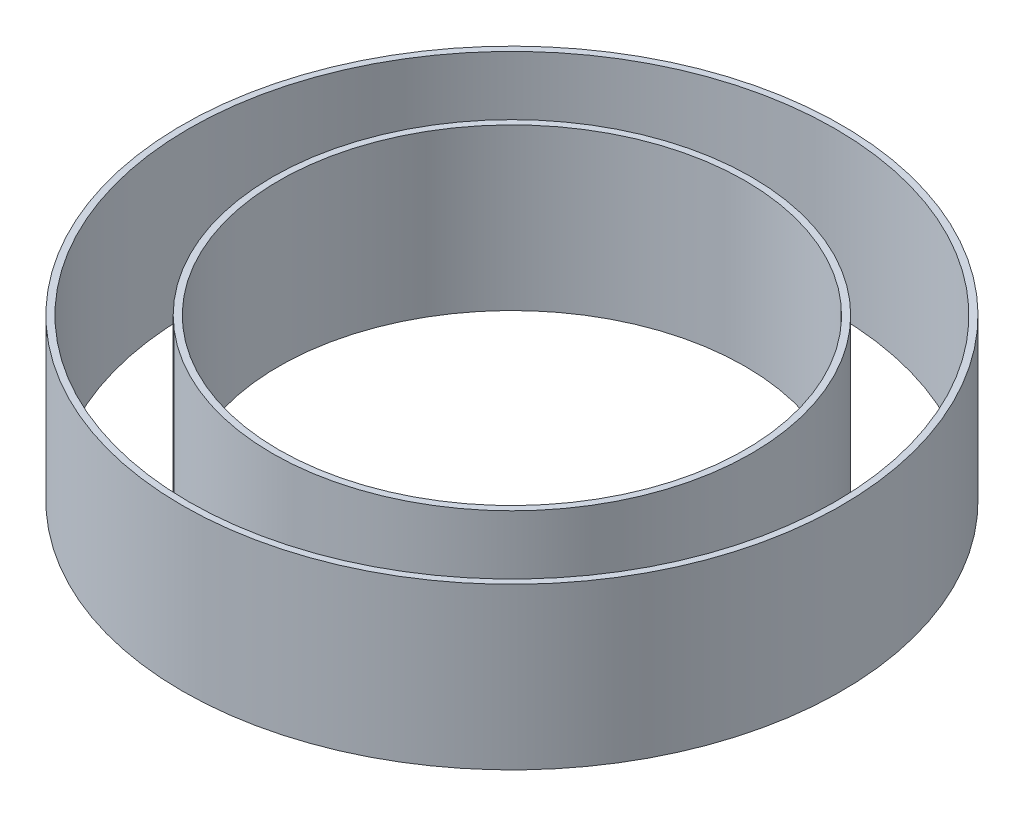
ISO-10303-21;
HEADER;
FILE_DESCRIPTION(('STEP AP214'),'2;1');
FILE_NAME('part.step','',(''),(''),'','','');
FILE_SCHEMA(('AUTOMOTIVE_DESIGN { 1 0 10303 214 1 1 1 1 }'));
ENDSEC;
DATA;
#1=APPLICATION_CONTEXT('core data for automotive mechanical design processes');
#2=APPLICATION_PROTOCOL_DEFINITION('international standard','automotive_design',2000,#1);
#3=PRODUCT_CONTEXT('',#1,'mechanical');
#4=PRODUCT('Part','Part','',(#3));
#5=PRODUCT_RELATED_PRODUCT_CATEGORY('part','',(#4));
#6=PRODUCT_DEFINITION_FORMATION('','',#4);
#7=PRODUCT_DEFINITION_CONTEXT('part definition',#1,'design');
#8=PRODUCT_DEFINITION('design','',#6,#7);
#9=PRODUCT_DEFINITION_SHAPE('','',#8);
#10=(LENGTH_UNIT() NAMED_UNIT(*) SI_UNIT(.MILLI.,.METRE.));
#11=(NAMED_UNIT(*) PLANE_ANGLE_UNIT() SI_UNIT($,.RADIAN.));
#12=(NAMED_UNIT(*) SI_UNIT($,.STERADIAN.) SOLID_ANGLE_UNIT());
#13=UNCERTAINTY_MEASURE_WITH_UNIT(LENGTH_MEASURE(1.E-05),#10,'distance_accuracy_value','');
#14=(GEOMETRIC_REPRESENTATION_CONTEXT(3) GLOBAL_UNCERTAINTY_ASSIGNED_CONTEXT((#13)) GLOBAL_UNIT_ASSIGNED_CONTEXT((#10,
#11,#12)) REPRESENTATION_CONTEXT('',''));
#15=CARTESIAN_POINT('',(0.,0.,0.));
#16=DIRECTION('',(0.,0.,1.));
#17=DIRECTION('',(1.,0.,0.));
#18=AXIS2_PLACEMENT_3D('',#15,#16,#17);
#19=CARTESIAN_POINT('',(0.,5.,0.));
#20=DIRECTION('',(0.,1.,0.));
#21=DIRECTION('',(0.,0.,1.));
#22=AXIS2_PLACEMENT_3D('',#19,#20,#21);
#23=PLANE('',#22);
#24=CARTESIAN_POINT('',(0.,5.,0.));
#25=DIRECTION('',(0.,1.,0.));
#26=DIRECTION('',(0.,0.,1.));
#27=AXIS2_PLACEMENT_3D('',#24,#25,#26);
#28=CIRCLE('',#27,14.9);
#29=CARTESIAN_POINT('',(0.,5.,14.9));
#30=VERTEX_POINT('',#29);
#31=EDGE_CURVE('E72',#30,#30,#28,.T.);
#32=ORIENTED_EDGE('',*,*,#31,.T.);
#33=EDGE_LOOP('',(#32));
#34=FACE_BOUND('',#33,.T.);
#35=CARTESIAN_POINT('',(0.,5.,0.));
#36=DIRECTION('',(0.,1.,0.));
#37=DIRECTION('',(0.,0.,1.));
#38=AXIS2_PLACEMENT_3D('',#35,#36,#37);
#39=CIRCLE('',#38,14.5);
#40=CARTESIAN_POINT('',(0.,5.,14.5));
#41=VERTEX_POINT('',#40);
#42=EDGE_CURVE('E63',#41,#41,#39,.T.);
#43=ORIENTED_EDGE('',*,*,#42,.F.);
#44=EDGE_LOOP('',(#43));
#45=FACE_BOUND('',#44,.T.);
#46=ADVANCED_FACE('F59',(#34,#45),#23,.T.);
#47=CARTESIAN_POINT('',(0.,-5.,0.));
#48=DIRECTION('',(0.,1.,0.));
#49=DIRECTION('',(0.,0.,1.));
#50=AXIS2_PLACEMENT_3D('',#47,#48,#49);
#51=PLANE('',#50);
#52=CARTESIAN_POINT('',(0.,-5.,0.));
#53=DIRECTION('',(0.,1.,0.));
#54=DIRECTION('',(0.,0.,1.));
#55=AXIS2_PLACEMENT_3D('',#52,#53,#54);
#56=CIRCLE('',#55,14.9);
#57=CARTESIAN_POINT('',(0.,-5.,14.9));
#58=VERTEX_POINT('',#57);
#59=EDGE_CURVE('E70',#58,#58,#56,.T.);
#60=ORIENTED_EDGE('',*,*,#59,.F.);
#61=EDGE_LOOP('',(#60));
#62=FACE_BOUND('',#61,.T.);
#63=CARTESIAN_POINT('',(0.,-5.,0.));
#64=DIRECTION('',(0.,1.,0.));
#65=DIRECTION('',(0.,0.,1.));
#66=AXIS2_PLACEMENT_3D('',#63,#64,#65);
#67=CIRCLE('',#66,14.5);
#68=CARTESIAN_POINT('',(0.,-5.,14.5));
#69=VERTEX_POINT('',#68);
#70=EDGE_CURVE('E12',#69,#69,#67,.T.);
#71=ORIENTED_EDGE('',*,*,#70,.T.);
#72=EDGE_LOOP('',(#71));
#73=FACE_BOUND('',#72,.T.);
#74=ADVANCED_FACE('F80',(#62,#73),#51,.F.);
#75=CARTESIAN_POINT('',(0.,5.,0.));
#76=DIRECTION('',(0.,-1.,0.));
#77=DIRECTION('',(0.,0.,-1.));
#78=AXIS2_PLACEMENT_3D('',#75,#76,#77);
#79=CYLINDRICAL_SURFACE('',#78,14.9);
#80=ORIENTED_EDGE('',*,*,#31,.F.);
#81=EDGE_LOOP('',(#80));
#82=FACE_BOUND('',#81,.T.);
#83=ORIENTED_EDGE('',*,*,#59,.T.);
#84=EDGE_LOOP('',(#83));
#85=FACE_BOUND('',#84,.T.);
#86=ADVANCED_FACE('F78',(#82,#85),#79,.T.);
#87=CARTESIAN_POINT('',(0.,5.,0.));
#88=DIRECTION('',(0.,-1.,0.));
#89=DIRECTION('',(0.,0.,-1.));
#90=AXIS2_PLACEMENT_3D('',#87,#88,#89);
#91=CYLINDRICAL_SURFACE('',#90,14.5);
#92=ORIENTED_EDGE('',*,*,#42,.T.);
#93=EDGE_LOOP('',(#92));
#94=FACE_BOUND('',#93,.T.);
#95=ORIENTED_EDGE('',*,*,#70,.F.);
#96=EDGE_LOOP('',(#95));
#97=FACE_BOUND('',#96,.T.);
#98=ADVANCED_FACE('F61',(#94,#97),#91,.F.);
#99=CLOSED_SHELL('',(#46,#74,#86,#98));
#100=MANIFOLD_SOLID_BREP('B2',#99);
#101=CARTESIAN_POINT('',(0.,5.,0.));
#102=DIRECTION('',(0.,-1.,0.));
#103=DIRECTION('',(0.,0.,-1.));
#104=AXIS2_PLACEMENT_3D('',#101,#102,#103);
#105=CYLINDRICAL_SURFACE('',#104,20.1);
#106=CARTESIAN_POINT('',(0.,5.,0.));
#107=DIRECTION('',(0.,1.,0.));
#108=DIRECTION('',(0.,0.,1.));
#109=AXIS2_PLACEMENT_3D('',#106,#107,#108);
#110=CIRCLE('',#109,20.1);
#111=CARTESIAN_POINT('',(0.,5.,20.1));
#112=VERTEX_POINT('',#111);
#113=EDGE_CURVE('E128',#112,#112,#110,.T.);
#114=ORIENTED_EDGE('',*,*,#113,.T.);
#115=EDGE_LOOP('',(#114));
#116=FACE_BOUND('',#115,.T.);
#117=CARTESIAN_POINT('',(0.,-5.,0.));
#118=DIRECTION('',(0.,1.,0.));
#119=DIRECTION('',(0.,0.,1.));
#120=AXIS2_PLACEMENT_3D('',#117,#118,#119);
#121=CIRCLE('',#120,20.1);
#122=CARTESIAN_POINT('',(0.,-5.,20.1));
#123=VERTEX_POINT('',#122);
#124=EDGE_CURVE('E134',#123,#123,#121,.T.);
#125=ORIENTED_EDGE('',*,*,#124,.F.);
#126=EDGE_LOOP('',(#125));
#127=FACE_BOUND('',#126,.T.);
#128=ADVANCED_FACE('F121',(#116,#127),#105,.F.);
#129=CARTESIAN_POINT('',(0.,5.,0.));
#130=DIRECTION('',(0.,-1.,0.));
#131=DIRECTION('',(0.,0.,-1.));
#132=AXIS2_PLACEMENT_3D('',#129,#130,#131);
#133=CYLINDRICAL_SURFACE('',#132,20.5);
#134=CARTESIAN_POINT('',(0.,5.,0.));
#135=DIRECTION('',(0.,1.,0.));
#136=DIRECTION('',(0.,0.,1.));
#137=AXIS2_PLACEMENT_3D('',#134,#135,#136);
#138=CIRCLE('',#137,20.5);
#139=CARTESIAN_POINT('',(0.,5.,20.5));
#140=VERTEX_POINT('',#139);
#141=EDGE_CURVE('E58',#140,#140,#138,.T.);
#142=ORIENTED_EDGE('',*,*,#141,.F.);
#143=EDGE_LOOP('',(#142));
#144=FACE_BOUND('',#143,.T.);
#145=CARTESIAN_POINT('',(0.,-5.,0.));
#146=DIRECTION('',(0.,1.,0.));
#147=DIRECTION('',(0.,0.,1.));
#148=AXIS2_PLACEMENT_3D('',#145,#146,#147);
#149=CIRCLE('',#148,20.5);
#150=CARTESIAN_POINT('',(0.,-5.,20.5));
#151=VERTEX_POINT('',#150);
#152=EDGE_CURVE('E124',#151,#151,#149,.T.);
#153=ORIENTED_EDGE('',*,*,#152,.T.);
#154=EDGE_LOOP('',(#153));
#155=FACE_BOUND('',#154,.T.);
#156=ADVANCED_FACE('F141',(#144,#155),#133,.T.);
#157=CARTESIAN_POINT('',(0.,5.,0.));
#158=DIRECTION('',(0.,1.,0.));
#159=DIRECTION('',(0.,0.,1.));
#160=AXIS2_PLACEMENT_3D('',#157,#158,#159);
#161=PLANE('',#160);
#162=ORIENTED_EDGE('',*,*,#113,.F.);
#163=EDGE_LOOP('',(#162));
#164=FACE_BOUND('',#163,.T.);
#165=ORIENTED_EDGE('',*,*,#141,.T.);
#166=EDGE_LOOP('',(#165));
#167=FACE_BOUND('',#166,.T.);
#168=ADVANCED_FACE('F145',(#164,#167),#161,.T.);
#169=CARTESIAN_POINT('',(0.,-5.,0.));
#170=DIRECTION('',(0.,1.,0.));
#171=DIRECTION('',(0.,0.,1.));
#172=AXIS2_PLACEMENT_3D('',#169,#170,#171);
#173=PLANE('',#172);
#174=ORIENTED_EDGE('',*,*,#124,.T.);
#175=EDGE_LOOP('',(#174));
#176=FACE_BOUND('',#175,.T.);
#177=ORIENTED_EDGE('',*,*,#152,.F.);
#178=EDGE_LOOP('',(#177));
#179=FACE_BOUND('',#178,.T.);
#180=ADVANCED_FACE('F143',(#176,#179),#173,.F.);
#181=CLOSED_SHELL('',(#128,#156,#168,#180));
#182=MANIFOLD_SOLID_BREP('B7',#181);
#183=ADVANCED_BREP_SHAPE_REPRESENTATION('',(#18,#100,#182),#14);
#184=SHAPE_DEFINITION_REPRESENTATION(#9,#183);
ENDSEC;
END-ISO-10303-21;
